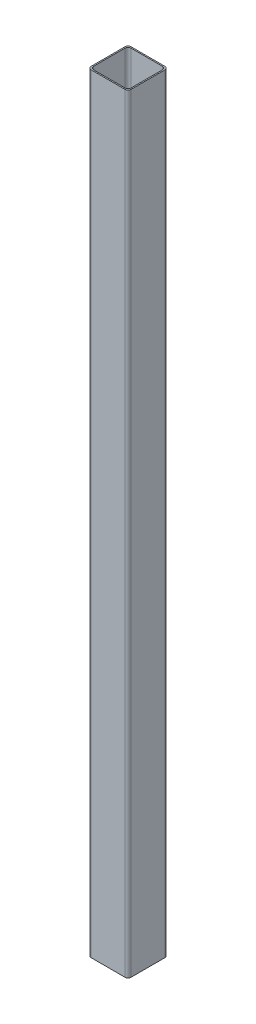
ISO-10303-21;
HEADER;
FILE_DESCRIPTION(('STEP AP214'),'2;1');
FILE_NAME('part.step','',(''),(''),'','','');
FILE_SCHEMA(('AUTOMOTIVE_DESIGN { 1 0 10303 214 1 1 1 1 }'));
ENDSEC;
DATA;
#1=APPLICATION_CONTEXT('core data for automotive mechanical design processes');
#2=APPLICATION_PROTOCOL_DEFINITION('international standard','automotive_design',2000,#1);
#3=PRODUCT_CONTEXT('',#1,'mechanical');
#4=PRODUCT('Part','Part','',(#3));
#5=PRODUCT_RELATED_PRODUCT_CATEGORY('part','',(#4));
#6=PRODUCT_DEFINITION_FORMATION('','',#4);
#7=PRODUCT_DEFINITION_CONTEXT('part definition',#1,'design');
#8=PRODUCT_DEFINITION('design','',#6,#7);
#9=PRODUCT_DEFINITION_SHAPE('','',#8);
#10=(LENGTH_UNIT() NAMED_UNIT(*) SI_UNIT(.MILLI.,.METRE.));
#11=(NAMED_UNIT(*) PLANE_ANGLE_UNIT() SI_UNIT($,.RADIAN.));
#12=(NAMED_UNIT(*) SI_UNIT($,.STERADIAN.) SOLID_ANGLE_UNIT());
#13=UNCERTAINTY_MEASURE_WITH_UNIT(LENGTH_MEASURE(1.E-05),#10,'distance_accuracy_value','');
#14=(GEOMETRIC_REPRESENTATION_CONTEXT(3) GLOBAL_UNCERTAINTY_ASSIGNED_CONTEXT((#13)) GLOBAL_UNIT_ASSIGNED_CONTEXT((#10,
#11,#12)) REPRESENTATION_CONTEXT('',''));
#15=CARTESIAN_POINT('',(0.,0.,0.));
#16=DIRECTION('',(0.,0.,1.));
#17=DIRECTION('',(1.,0.,0.));
#18=AXIS2_PLACEMENT_3D('',#15,#16,#17);
#19=CARTESIAN_POINT('',(0.,385.,0.));
#20=DIRECTION('',(0.,1.,0.));
#21=DIRECTION('',(0.,0.,1.));
#22=AXIS2_PLACEMENT_3D('',#19,#20,#21);
#23=PLANE('',#22);
#24=DIRECTION('',(-1.,0.,0.));
#25=VECTOR('',#24,1.);
#26=CARTESIAN_POINT('',(20.,385.,-20.));
#27=LINE('',#26,#25);
#28=CARTESIAN_POINT('',(17.,385.,-20.));
#29=VERTEX_POINT('',#28);
#30=CARTESIAN_POINT('',(-17.,385.,-20.));
#31=VERTEX_POINT('',#30);
#32=EDGE_CURVE('E183',#29,#31,#27,.T.);
#33=ORIENTED_EDGE('',*,*,#32,.T.);
#34=CARTESIAN_POINT('',(-17.,385.,-17.));
#35=DIRECTION('',(0.,1.,0.));
#36=DIRECTION('',(0.,0.,1.));
#37=AXIS2_PLACEMENT_3D('',#34,#35,#36);
#38=CIRCLE('',#37,3.);
#39=CARTESIAN_POINT('',(-20.,385.,-17.));
#40=VERTEX_POINT('',#39);
#41=EDGE_CURVE('E203',#31,#40,#38,.T.);
#42=ORIENTED_EDGE('',*,*,#41,.T.);
#43=DIRECTION('',(0.,0.,1.));
#44=VECTOR('',#43,1.);
#45=CARTESIAN_POINT('',(-20.,385.,20.));
#46=LINE('',#45,#44);
#47=CARTESIAN_POINT('',(-20.,385.,17.));
#48=VERTEX_POINT('',#47);
#49=EDGE_CURVE('E165',#40,#48,#46,.T.);
#50=ORIENTED_EDGE('',*,*,#49,.T.);
#51=CARTESIAN_POINT('',(-17.,385.,17.));
#52=DIRECTION('',(0.,1.,0.));
#53=DIRECTION('',(0.,0.,1.));
#54=AXIS2_PLACEMENT_3D('',#51,#52,#53);
#55=CIRCLE('',#54,3.);
#56=CARTESIAN_POINT('',(-17.,385.,20.));
#57=VERTEX_POINT('',#56);
#58=EDGE_CURVE('E199',#48,#57,#55,.T.);
#59=ORIENTED_EDGE('',*,*,#58,.T.);
#60=DIRECTION('',(1.,0.,0.));
#61=VECTOR('',#60,1.);
#62=CARTESIAN_POINT('',(20.,385.,20.));
#63=LINE('',#62,#61);
#64=CARTESIAN_POINT('',(17.,385.,20.));
#65=VERTEX_POINT('',#64);
#66=EDGE_CURVE('E275',#57,#65,#63,.T.);
#67=ORIENTED_EDGE('',*,*,#66,.T.);
#68=CARTESIAN_POINT('',(17.,385.,17.));
#69=DIRECTION('',(0.,1.,0.));
#70=DIRECTION('',(0.,0.,1.));
#71=AXIS2_PLACEMENT_3D('',#68,#69,#70);
#72=CIRCLE('',#71,3.);
#73=CARTESIAN_POINT('',(20.,385.,17.));
#74=VERTEX_POINT('',#73);
#75=EDGE_CURVE('E197',#65,#74,#72,.T.);
#76=ORIENTED_EDGE('',*,*,#75,.T.);
#77=DIRECTION('',(0.,0.,-1.));
#78=VECTOR('',#77,1.);
#79=CARTESIAN_POINT('',(20.,385.,20.));
#80=LINE('',#79,#78);
#81=CARTESIAN_POINT('',(20.,385.,-17.));
#82=VERTEX_POINT('',#81);
#83=EDGE_CURVE('E277',#74,#82,#80,.T.);
#84=ORIENTED_EDGE('',*,*,#83,.T.);
#85=CARTESIAN_POINT('',(17.,385.,-17.));
#86=DIRECTION('',(0.,1.,0.));
#87=DIRECTION('',(0.,0.,1.));
#88=AXIS2_PLACEMENT_3D('',#85,#86,#87);
#89=CIRCLE('',#88,3.);
#90=EDGE_CURVE('E201',#82,#29,#89,.T.);
#91=ORIENTED_EDGE('',*,*,#90,.T.);
#92=EDGE_LOOP('',(#33,#42,#50,#59,#67,#76,#84,#91));
#93=FACE_BOUND('',#92,.T.);
#94=DIRECTION('',(0.,0.,-1.));
#95=VECTOR('',#94,1.);
#96=CARTESIAN_POINT('',(18.8,385.,18.8));
#97=LINE('',#96,#95);
#98=CARTESIAN_POINT('',(18.8,385.,15.8));
#99=VERTEX_POINT('',#98);
#100=CARTESIAN_POINT('',(18.8,385.,-15.8));
#101=VERTEX_POINT('',#100);
#102=EDGE_CURVE('E261',#99,#101,#97,.T.);
#103=ORIENTED_EDGE('',*,*,#102,.F.);
#104=CARTESIAN_POINT('',(15.8,385.,15.8));
#105=DIRECTION('',(0.,1.,0.));
#106=DIRECTION('',(0.,0.,1.));
#107=AXIS2_PLACEMENT_3D('',#104,#105,#106);
#108=CIRCLE('',#107,3.);
#109=CARTESIAN_POINT('',(15.8,385.,18.8));
#110=VERTEX_POINT('',#109);
#111=EDGE_CURVE('E240',#99,#110,#108,.F.);
#112=ORIENTED_EDGE('',*,*,#111,.T.);
#113=DIRECTION('',(1.,0.,0.));
#114=VECTOR('',#113,1.);
#115=CARTESIAN_POINT('',(18.8,385.,18.8));
#116=LINE('',#115,#114);
#117=CARTESIAN_POINT('',(-15.8,385.,18.8));
#118=VERTEX_POINT('',#117);
#119=EDGE_CURVE('E256',#118,#110,#116,.T.);
#120=ORIENTED_EDGE('',*,*,#119,.F.);
#121=CARTESIAN_POINT('',(-15.8,385.,15.8));
#122=DIRECTION('',(0.,1.,0.));
#123=DIRECTION('',(0.,0.,1.));
#124=AXIS2_PLACEMENT_3D('',#121,#122,#123);
#125=CIRCLE('',#124,3.);
#126=CARTESIAN_POINT('',(-18.8,385.,15.8));
#127=VERTEX_POINT('',#126);
#128=EDGE_CURVE('E244',#118,#127,#125,.F.);
#129=ORIENTED_EDGE('',*,*,#128,.T.);
#130=DIRECTION('',(0.,0.,1.));
#131=VECTOR('',#130,1.);
#132=CARTESIAN_POINT('',(-18.8,385.,18.8));
#133=LINE('',#132,#131);
#134=CARTESIAN_POINT('',(-18.8,385.,-15.8));
#135=VERTEX_POINT('',#134);
#136=EDGE_CURVE('E174',#135,#127,#133,.T.);
#137=ORIENTED_EDGE('',*,*,#136,.F.);
#138=CARTESIAN_POINT('',(-15.8,385.,-15.8));
#139=DIRECTION('',(0.,1.,0.));
#140=DIRECTION('',(0.,0.,1.));
#141=AXIS2_PLACEMENT_3D('',#138,#139,#140);
#142=CIRCLE('',#141,3.);
#143=CARTESIAN_POINT('',(-15.8,385.,-18.8));
#144=VERTEX_POINT('',#143);
#145=EDGE_CURVE('E11',#135,#144,#142,.F.);
#146=ORIENTED_EDGE('',*,*,#145,.T.);
#147=DIRECTION('',(-1.,0.,0.));
#148=VECTOR('',#147,1.);
#149=CARTESIAN_POINT('',(18.8,385.,-18.8));
#150=LINE('',#149,#148);
#151=CARTESIAN_POINT('',(15.8,385.,-18.8));
#152=VERTEX_POINT('',#151);
#153=EDGE_CURVE('E180',#152,#144,#150,.T.);
#154=ORIENTED_EDGE('',*,*,#153,.F.);
#155=CARTESIAN_POINT('',(15.8,385.,-15.8));
#156=DIRECTION('',(0.,1.,0.));
#157=DIRECTION('',(0.,0.,1.));
#158=AXIS2_PLACEMENT_3D('',#155,#156,#157);
#159=CIRCLE('',#158,3.);
#160=EDGE_CURVE('E236',#152,#101,#159,.F.);
#161=ORIENTED_EDGE('',*,*,#160,.T.);
#162=EDGE_LOOP('',(#103,#112,#120,#129,#137,#146,#154,#161));
#163=FACE_BOUND('',#162,.T.);
#164=ADVANCED_FACE('F32',(#93,#163),#23,.T.);
#165=CARTESIAN_POINT('',(0.,-385.,0.));
#166=DIRECTION('',(0.,1.,0.));
#167=DIRECTION('',(0.,0.,1.));
#168=AXIS2_PLACEMENT_3D('',#165,#166,#167);
#169=PLANE('',#168);
#170=DIRECTION('',(0.,0.,1.));
#171=VECTOR('',#170,1.);
#172=CARTESIAN_POINT('',(-20.,-385.,20.));
#173=LINE('',#172,#171);
#174=CARTESIAN_POINT('',(-20.,-385.,-17.));
#175=VERTEX_POINT('',#174);
#176=CARTESIAN_POINT('',(-20.,-385.,17.));
#177=VERTEX_POINT('',#176);
#178=EDGE_CURVE('E162',#175,#177,#173,.T.);
#179=ORIENTED_EDGE('',*,*,#178,.F.);
#180=CARTESIAN_POINT('',(-17.,-385.,-17.));
#181=DIRECTION('',(0.,1.,0.));
#182=DIRECTION('',(0.,0.,1.));
#183=AXIS2_PLACEMENT_3D('',#180,#181,#182);
#184=CIRCLE('',#183,3.);
#185=CARTESIAN_POINT('',(-17.,-385.,-20.));
#186=VERTEX_POINT('',#185);
#187=EDGE_CURVE('E145',#175,#186,#184,.F.);
#188=ORIENTED_EDGE('',*,*,#187,.T.);
#189=DIRECTION('',(-1.,0.,0.));
#190=VECTOR('',#189,1.);
#191=CARTESIAN_POINT('',(20.,-385.,-20.));
#192=LINE('',#191,#190);
#193=CARTESIAN_POINT('',(17.,-385.,-20.));
#194=VERTEX_POINT('',#193);
#195=EDGE_CURVE('E188',#194,#186,#192,.T.);
#196=ORIENTED_EDGE('',*,*,#195,.F.);
#197=CARTESIAN_POINT('',(17.,-385.,-17.));
#198=DIRECTION('',(0.,1.,0.));
#199=DIRECTION('',(0.,0.,1.));
#200=AXIS2_PLACEMENT_3D('',#197,#198,#199);
#201=CIRCLE('',#200,3.);
#202=CARTESIAN_POINT('',(20.,-385.,-17.));
#203=VERTEX_POINT('',#202);
#204=EDGE_CURVE('E156',#194,#203,#201,.F.);
#205=ORIENTED_EDGE('',*,*,#204,.T.);
#206=DIRECTION('',(0.,0.,-1.));
#207=VECTOR('',#206,1.);
#208=CARTESIAN_POINT('',(20.,-385.,20.));
#209=LINE('',#208,#207);
#210=CARTESIAN_POINT('',(20.,-385.,17.));
#211=VERTEX_POINT('',#210);
#212=EDGE_CURVE('E177',#211,#203,#209,.T.);
#213=ORIENTED_EDGE('',*,*,#212,.F.);
#214=CARTESIAN_POINT('',(17.,-385.,17.));
#215=DIRECTION('',(0.,1.,0.));
#216=DIRECTION('',(0.,0.,1.));
#217=AXIS2_PLACEMENT_3D('',#214,#215,#216);
#218=CIRCLE('',#217,3.);
#219=CARTESIAN_POINT('',(17.,-385.,20.));
#220=VERTEX_POINT('',#219);
#221=EDGE_CURVE('E166',#211,#220,#218,.F.);
#222=ORIENTED_EDGE('',*,*,#221,.T.);
#223=DIRECTION('',(1.,0.,0.));
#224=VECTOR('',#223,1.);
#225=CARTESIAN_POINT('',(20.,-385.,20.));
#226=LINE('',#225,#224);
#227=CARTESIAN_POINT('',(-17.,-385.,20.));
#228=VERTEX_POINT('',#227);
#229=EDGE_CURVE('E173',#228,#220,#226,.T.);
#230=ORIENTED_EDGE('',*,*,#229,.F.);
#231=CARTESIAN_POINT('',(-17.,-385.,17.));
#232=DIRECTION('',(0.,1.,0.));
#233=DIRECTION('',(0.,0.,1.));
#234=AXIS2_PLACEMENT_3D('',#231,#232,#233);
#235=CIRCLE('',#234,3.);
#236=EDGE_CURVE('E172',#228,#177,#235,.F.);
#237=ORIENTED_EDGE('',*,*,#236,.T.);
#238=EDGE_LOOP('',(#179,#188,#196,#205,#213,#222,#230,#237));
#239=FACE_BOUND('',#238,.T.);
#240=DIRECTION('',(0.,0.,1.));
#241=VECTOR('',#240,1.);
#242=CARTESIAN_POINT('',(-18.8,-385.,18.8));
#243=LINE('',#242,#241);
#244=CARTESIAN_POINT('',(-18.8,-385.,-15.8));
#245=VERTEX_POINT('',#244);
#246=CARTESIAN_POINT('',(-18.8,-385.,15.8));
#247=VERTEX_POINT('',#246);
#248=EDGE_CURVE('E248',#245,#247,#243,.T.);
#249=ORIENTED_EDGE('',*,*,#248,.T.);
#250=CARTESIAN_POINT('',(-15.8,-385.,15.8));
#251=DIRECTION('',(0.,1.,0.));
#252=DIRECTION('',(0.,0.,1.));
#253=AXIS2_PLACEMENT_3D('',#250,#251,#252);
#254=CIRCLE('',#253,3.);
#255=CARTESIAN_POINT('',(-15.8,-385.,18.8));
#256=VERTEX_POINT('',#255);
#257=EDGE_CURVE('E242',#247,#256,#254,.T.);
#258=ORIENTED_EDGE('',*,*,#257,.T.);
#259=DIRECTION('',(1.,0.,0.));
#260=VECTOR('',#259,1.);
#261=CARTESIAN_POINT('',(18.8,-385.,18.8));
#262=LINE('',#261,#260);
#263=CARTESIAN_POINT('',(15.8,-385.,18.8));
#264=VERTEX_POINT('',#263);
#265=EDGE_CURVE('E267',#256,#264,#262,.T.);
#266=ORIENTED_EDGE('',*,*,#265,.T.);
#267=CARTESIAN_POINT('',(15.8,-385.,15.8));
#268=DIRECTION('',(0.,1.,0.));
#269=DIRECTION('',(0.,0.,1.));
#270=AXIS2_PLACEMENT_3D('',#267,#268,#269);
#271=CIRCLE('',#270,3.);
#272=CARTESIAN_POINT('',(18.8,-385.,15.8));
#273=VERTEX_POINT('',#272);
#274=EDGE_CURVE('E238',#264,#273,#271,.T.);
#275=ORIENTED_EDGE('',*,*,#274,.T.);
#276=DIRECTION('',(0.,0.,-1.));
#277=VECTOR('',#276,1.);
#278=CARTESIAN_POINT('',(18.8,-385.,18.8));
#279=LINE('',#278,#277);
#280=CARTESIAN_POINT('',(18.8,-385.,-15.8));
#281=VERTEX_POINT('',#280);
#282=EDGE_CURVE('E270',#273,#281,#279,.T.);
#283=ORIENTED_EDGE('',*,*,#282,.T.);
#284=CARTESIAN_POINT('',(15.8,-385.,-15.8));
#285=DIRECTION('',(0.,1.,0.));
#286=DIRECTION('',(0.,0.,1.));
#287=AXIS2_PLACEMENT_3D('',#284,#285,#286);
#288=CIRCLE('',#287,3.);
#289=CARTESIAN_POINT('',(15.8,-385.,-18.8));
#290=VERTEX_POINT('',#289);
#291=EDGE_CURVE('E234',#281,#290,#288,.T.);
#292=ORIENTED_EDGE('',*,*,#291,.T.);
#293=DIRECTION('',(-1.,0.,0.));
#294=VECTOR('',#293,1.);
#295=CARTESIAN_POINT('',(18.8,-385.,-18.8));
#296=LINE('',#295,#294);
#297=CARTESIAN_POINT('',(-15.8,-385.,-18.8));
#298=VERTEX_POINT('',#297);
#299=EDGE_CURVE('E249',#290,#298,#296,.T.);
#300=ORIENTED_EDGE('',*,*,#299,.T.);
#301=CARTESIAN_POINT('',(-15.8,-385.,-15.8));
#302=DIRECTION('',(0.,1.,0.));
#303=DIRECTION('',(0.,0.,1.));
#304=AXIS2_PLACEMENT_3D('',#301,#302,#303);
#305=CIRCLE('',#304,3.);
#306=EDGE_CURVE('E40',#298,#245,#305,.T.);
#307=ORIENTED_EDGE('',*,*,#306,.T.);
#308=EDGE_LOOP('',(#249,#258,#266,#275,#283,#292,#300,#307));
#309=FACE_BOUND('',#308,.T.);
#310=ADVANCED_FACE('F169',(#239,#309),#169,.F.);
#311=CARTESIAN_POINT('',(-20.,385.,20.));
#312=DIRECTION('',(1.,0.,0.));
#313=DIRECTION('',(0.,0.,-1.));
#314=AXIS2_PLACEMENT_3D('',#311,#312,#313);
#315=PLANE('',#314);
#316=ORIENTED_EDGE('',*,*,#49,.F.);
#317=DIRECTION('',(0.,-1.,0.));
#318=VECTOR('',#317,1.);
#319=CARTESIAN_POINT('',(-20.,385.,-17.));
#320=LINE('',#319,#318);
#321=EDGE_CURVE('E149',#40,#175,#320,.T.);
#322=ORIENTED_EDGE('',*,*,#321,.T.);
#323=ORIENTED_EDGE('',*,*,#178,.T.);
#324=DIRECTION('',(0.,-1.,0.));
#325=VECTOR('',#324,1.);
#326=CARTESIAN_POINT('',(-20.,385.,17.));
#327=LINE('',#326,#325);
#328=EDGE_CURVE('E167',#177,#48,#327,.F.);
#329=ORIENTED_EDGE('',*,*,#328,.T.);
#330=EDGE_LOOP('',(#316,#322,#323,#329));
#331=FACE_BOUND('',#330,.T.);
#332=ADVANCED_FACE('F161',(#331),#315,.F.);
#333=CARTESIAN_POINT('',(20.,385.,20.));
#334=DIRECTION('',(0.,0.,-1.));
#335=DIRECTION('',(-1.,0.,0.));
#336=AXIS2_PLACEMENT_3D('',#333,#334,#335);
#337=PLANE('',#336);
#338=ORIENTED_EDGE('',*,*,#66,.F.);
#339=DIRECTION('',(0.,-1.,0.));
#340=VECTOR('',#339,1.);
#341=CARTESIAN_POINT('',(-17.,385.,20.));
#342=LINE('',#341,#340);
#343=EDGE_CURVE('E231',#57,#228,#342,.T.);
#344=ORIENTED_EDGE('',*,*,#343,.T.);
#345=ORIENTED_EDGE('',*,*,#229,.T.);
#346=DIRECTION('',(0.,-1.,0.));
#347=VECTOR('',#346,1.);
#348=CARTESIAN_POINT('',(17.,385.,20.));
#349=LINE('',#348,#347);
#350=EDGE_CURVE('E229',#220,#65,#349,.F.);
#351=ORIENTED_EDGE('',*,*,#350,.T.);
#352=EDGE_LOOP('',(#338,#344,#345,#351));
#353=FACE_BOUND('',#352,.T.);
#354=ADVANCED_FACE('F299',(#353),#337,.F.);
#355=CARTESIAN_POINT('',(20.,385.,20.));
#356=DIRECTION('',(-1.,0.,0.));
#357=DIRECTION('',(0.,0.,1.));
#358=AXIS2_PLACEMENT_3D('',#355,#356,#357);
#359=PLANE('',#358);
#360=ORIENTED_EDGE('',*,*,#212,.T.);
#361=DIRECTION('',(0.,-1.,0.));
#362=VECTOR('',#361,1.);
#363=CARTESIAN_POINT('',(20.,385.,-17.));
#364=LINE('',#363,#362);
#365=EDGE_CURVE('E208',#203,#82,#364,.F.);
#366=ORIENTED_EDGE('',*,*,#365,.T.);
#367=ORIENTED_EDGE('',*,*,#83,.F.);
#368=DIRECTION('',(0.,-1.,0.));
#369=VECTOR('',#368,1.);
#370=CARTESIAN_POINT('',(20.,385.,17.));
#371=LINE('',#370,#369);
#372=EDGE_CURVE('E205',#74,#211,#371,.T.);
#373=ORIENTED_EDGE('',*,*,#372,.T.);
#374=EDGE_LOOP('',(#360,#366,#367,#373));
#375=FACE_BOUND('',#374,.T.);
#376=ADVANCED_FACE('F292',(#375),#359,.F.);
#377=CARTESIAN_POINT('',(20.,385.,-20.));
#378=DIRECTION('',(0.,0.,1.));
#379=DIRECTION('',(1.,0.,0.));
#380=AXIS2_PLACEMENT_3D('',#377,#378,#379);
#381=PLANE('',#380);
#382=ORIENTED_EDGE('',*,*,#195,.T.);
#383=DIRECTION('',(0.,-1.,0.));
#384=VECTOR('',#383,1.);
#385=CARTESIAN_POINT('',(-17.,385.,-20.));
#386=LINE('',#385,#384);
#387=EDGE_CURVE('E150',#186,#31,#386,.F.);
#388=ORIENTED_EDGE('',*,*,#387,.T.);
#389=ORIENTED_EDGE('',*,*,#32,.F.);
#390=DIRECTION('',(0.,-1.,0.));
#391=VECTOR('',#390,1.);
#392=CARTESIAN_POINT('',(17.,385.,-20.));
#393=LINE('',#392,#391);
#394=EDGE_CURVE('E155',#29,#194,#393,.T.);
#395=ORIENTED_EDGE('',*,*,#394,.T.);
#396=EDGE_LOOP('',(#382,#388,#389,#395));
#397=FACE_BOUND('',#396,.T.);
#398=ADVANCED_FACE('F286',(#397),#381,.F.);
#399=CARTESIAN_POINT('',(18.8,385.,18.8));
#400=DIRECTION('',(0.,0.,-1.));
#401=DIRECTION('',(-1.,0.,0.));
#402=AXIS2_PLACEMENT_3D('',#399,#400,#401);
#403=PLANE('',#402);
#404=ORIENTED_EDGE('',*,*,#119,.T.);
#405=DIRECTION('',(0.,-1.,0.));
#406=VECTOR('',#405,1.);
#407=CARTESIAN_POINT('',(15.8,-385.,18.8));
#408=LINE('',#407,#406);
#409=EDGE_CURVE('E221',#110,#264,#408,.T.);
#410=ORIENTED_EDGE('',*,*,#409,.T.);
#411=ORIENTED_EDGE('',*,*,#265,.F.);
#412=DIRECTION('',(0.,-1.,0.));
#413=VECTOR('',#412,1.);
#414=CARTESIAN_POINT('',(-15.8,385.,18.8));
#415=LINE('',#414,#413);
#416=EDGE_CURVE('E219',#256,#118,#415,.F.);
#417=ORIENTED_EDGE('',*,*,#416,.T.);
#418=EDGE_LOOP('',(#404,#410,#411,#417));
#419=FACE_BOUND('',#418,.T.);
#420=ADVANCED_FACE('F318',(#419),#403,.T.);
#421=CARTESIAN_POINT('',(18.8,385.,18.8));
#422=DIRECTION('',(-1.,0.,0.));
#423=DIRECTION('',(0.,0.,1.));
#424=AXIS2_PLACEMENT_3D('',#421,#422,#423);
#425=PLANE('',#424);
#426=ORIENTED_EDGE('',*,*,#102,.T.);
#427=DIRECTION('',(0.,-1.,0.));
#428=VECTOR('',#427,1.);
#429=CARTESIAN_POINT('',(18.8,-385.,-15.8));
#430=LINE('',#429,#428);
#431=EDGE_CURVE('E212',#101,#281,#430,.T.);
#432=ORIENTED_EDGE('',*,*,#431,.T.);
#433=ORIENTED_EDGE('',*,*,#282,.F.);
#434=DIRECTION('',(0.,-1.,0.));
#435=VECTOR('',#434,1.);
#436=CARTESIAN_POINT('',(18.8,385.,15.8));
#437=LINE('',#436,#435);
#438=EDGE_CURVE('E210',#273,#99,#437,.F.);
#439=ORIENTED_EDGE('',*,*,#438,.T.);
#440=EDGE_LOOP('',(#426,#432,#433,#439));
#441=FACE_BOUND('',#440,.T.);
#442=ADVANCED_FACE('F357',(#441),#425,.T.);
#443=CARTESIAN_POINT('',(18.8,385.,-18.8));
#444=DIRECTION('',(0.,0.,1.));
#445=DIRECTION('',(1.,0.,0.));
#446=AXIS2_PLACEMENT_3D('',#443,#444,#445);
#447=PLANE('',#446);
#448=ORIENTED_EDGE('',*,*,#299,.F.);
#449=DIRECTION('',(0.,-1.,0.));
#450=VECTOR('',#449,1.);
#451=CARTESIAN_POINT('',(15.8,385.,-18.8));
#452=LINE('',#451,#450);
#453=EDGE_CURVE('E52',#290,#152,#452,.F.);
#454=ORIENTED_EDGE('',*,*,#453,.T.);
#455=ORIENTED_EDGE('',*,*,#153,.T.);
#456=DIRECTION('',(0.,-1.,0.));
#457=VECTOR('',#456,1.);
#458=CARTESIAN_POINT('',(-15.8,-385.,-18.8));
#459=LINE('',#458,#457);
#460=EDGE_CURVE('E215',#144,#298,#459,.T.);
#461=ORIENTED_EDGE('',*,*,#460,.T.);
#462=EDGE_LOOP('',(#448,#454,#455,#461));
#463=FACE_BOUND('',#462,.T.);
#464=ADVANCED_FACE('F259',(#463),#447,.T.);
#465=CARTESIAN_POINT('',(-18.8,385.,18.8));
#466=DIRECTION('',(1.,0.,0.));
#467=DIRECTION('',(0.,0.,-1.));
#468=AXIS2_PLACEMENT_3D('',#465,#466,#467);
#469=PLANE('',#468);
#470=ORIENTED_EDGE('',*,*,#136,.T.);
#471=DIRECTION('',(0.,-1.,0.));
#472=VECTOR('',#471,1.);
#473=CARTESIAN_POINT('',(-18.8,-385.,15.8));
#474=LINE('',#473,#472);
#475=EDGE_CURVE('E226',#127,#247,#474,.T.);
#476=ORIENTED_EDGE('',*,*,#475,.T.);
#477=ORIENTED_EDGE('',*,*,#248,.F.);
#478=DIRECTION('',(0.,-1.,0.));
#479=VECTOR('',#478,1.);
#480=CARTESIAN_POINT('',(-18.8,385.,-15.8));
#481=LINE('',#480,#479);
#482=EDGE_CURVE('E224',#245,#135,#481,.F.);
#483=ORIENTED_EDGE('',*,*,#482,.T.);
#484=EDGE_LOOP('',(#470,#476,#477,#483));
#485=FACE_BOUND('',#484,.T.);
#486=ADVANCED_FACE('F254',(#485),#469,.T.);
#487=CARTESIAN_POINT('',(-17.,385.,-17.));
#488=DIRECTION('',(0.,-1.,0.));
#489=DIRECTION('',(0.,0.,-1.));
#490=AXIS2_PLACEMENT_3D('',#487,#488,#489);
#491=CYLINDRICAL_SURFACE('',#490,3.);
#492=ORIENTED_EDGE('',*,*,#41,.F.);
#493=ORIENTED_EDGE('',*,*,#387,.F.);
#494=ORIENTED_EDGE('',*,*,#187,.F.);
#495=ORIENTED_EDGE('',*,*,#321,.F.);
#496=EDGE_LOOP('',(#492,#493,#494,#495));
#497=FACE_BOUND('',#496,.T.);
#498=ADVANCED_FACE('F148',(#497),#491,.T.);
#499=CARTESIAN_POINT('',(17.,385.,-17.));
#500=DIRECTION('',(0.,-1.,0.));
#501=DIRECTION('',(0.,0.,-1.));
#502=AXIS2_PLACEMENT_3D('',#499,#500,#501);
#503=CYLINDRICAL_SURFACE('',#502,3.);
#504=ORIENTED_EDGE('',*,*,#90,.F.);
#505=ORIENTED_EDGE('',*,*,#365,.F.);
#506=ORIENTED_EDGE('',*,*,#204,.F.);
#507=ORIENTED_EDGE('',*,*,#394,.F.);
#508=EDGE_LOOP('',(#504,#505,#506,#507));
#509=FACE_BOUND('',#508,.T.);
#510=ADVANCED_FACE('F288',(#509),#503,.T.);
#511=CARTESIAN_POINT('',(15.8,385.,-15.8));
#512=DIRECTION('',(0.,1.,0.));
#513=DIRECTION('',(0.,0.,1.));
#514=AXIS2_PLACEMENT_3D('',#511,#512,#513);
#515=CYLINDRICAL_SURFACE('',#514,3.);
#516=ORIENTED_EDGE('',*,*,#160,.F.);
#517=ORIENTED_EDGE('',*,*,#453,.F.);
#518=ORIENTED_EDGE('',*,*,#291,.F.);
#519=ORIENTED_EDGE('',*,*,#431,.F.);
#520=EDGE_LOOP('',(#516,#517,#518,#519));
#521=FACE_BOUND('',#520,.T.);
#522=ADVANCED_FACE('F333',(#521),#515,.F.);
#523=CARTESIAN_POINT('',(15.8,385.,15.8));
#524=DIRECTION('',(0.,1.,0.));
#525=DIRECTION('',(0.,0.,1.));
#526=AXIS2_PLACEMENT_3D('',#523,#524,#525);
#527=CYLINDRICAL_SURFACE('',#526,3.);
#528=ORIENTED_EDGE('',*,*,#111,.F.);
#529=ORIENTED_EDGE('',*,*,#438,.F.);
#530=ORIENTED_EDGE('',*,*,#274,.F.);
#531=ORIENTED_EDGE('',*,*,#409,.F.);
#532=EDGE_LOOP('',(#528,#529,#530,#531));
#533=FACE_BOUND('',#532,.T.);
#534=ADVANCED_FACE('F336',(#533),#527,.F.);
#535=CARTESIAN_POINT('',(-15.8,385.,15.8));
#536=DIRECTION('',(0.,1.,0.));
#537=DIRECTION('',(0.,0.,1.));
#538=AXIS2_PLACEMENT_3D('',#535,#536,#537);
#539=CYLINDRICAL_SURFACE('',#538,3.);
#540=ORIENTED_EDGE('',*,*,#128,.F.);
#541=ORIENTED_EDGE('',*,*,#416,.F.);
#542=ORIENTED_EDGE('',*,*,#257,.F.);
#543=ORIENTED_EDGE('',*,*,#475,.F.);
#544=EDGE_LOOP('',(#540,#541,#542,#543));
#545=FACE_BOUND('',#544,.T.);
#546=ADVANCED_FACE('F309',(#545),#539,.F.);
#547=CARTESIAN_POINT('',(-15.8,385.,-15.8));
#548=DIRECTION('',(0.,1.,0.));
#549=DIRECTION('',(0.,0.,1.));
#550=AXIS2_PLACEMENT_3D('',#547,#548,#549);
#551=CYLINDRICAL_SURFACE('',#550,3.);
#552=ORIENTED_EDGE('',*,*,#145,.F.);
#553=ORIENTED_EDGE('',*,*,#482,.F.);
#554=ORIENTED_EDGE('',*,*,#306,.F.);
#555=ORIENTED_EDGE('',*,*,#460,.F.);
#556=EDGE_LOOP('',(#552,#553,#554,#555));
#557=FACE_BOUND('',#556,.T.);
#558=ADVANCED_FACE('F258',(#557),#551,.F.);
#559=CARTESIAN_POINT('',(-17.,385.,17.));
#560=DIRECTION('',(0.,-1.,0.));
#561=DIRECTION('',(0.,0.,-1.));
#562=AXIS2_PLACEMENT_3D('',#559,#560,#561);
#563=CYLINDRICAL_SURFACE('',#562,3.);
#564=ORIENTED_EDGE('',*,*,#58,.F.);
#565=ORIENTED_EDGE('',*,*,#328,.F.);
#566=ORIENTED_EDGE('',*,*,#236,.F.);
#567=ORIENTED_EDGE('',*,*,#343,.F.);
#568=EDGE_LOOP('',(#564,#565,#566,#567));
#569=FACE_BOUND('',#568,.T.);
#570=ADVANCED_FACE('F303',(#569),#563,.T.);
#571=CARTESIAN_POINT('',(17.,385.,17.));
#572=DIRECTION('',(0.,-1.,0.));
#573=DIRECTION('',(0.,0.,-1.));
#574=AXIS2_PLACEMENT_3D('',#571,#572,#573);
#575=CYLINDRICAL_SURFACE('',#574,3.);
#576=ORIENTED_EDGE('',*,*,#75,.F.);
#577=ORIENTED_EDGE('',*,*,#350,.F.);
#578=ORIENTED_EDGE('',*,*,#221,.F.);
#579=ORIENTED_EDGE('',*,*,#372,.F.);
#580=EDGE_LOOP('',(#576,#577,#578,#579));
#581=FACE_BOUND('',#580,.T.);
#582=ADVANCED_FACE('F34',(#581),#575,.T.);
#583=CLOSED_SHELL('',(#164,#310,#332,#354,#376,#398,#420,#442,#464,#486,#498,#510,#522,#534,
#546,#558,#570,#582));
#584=MANIFOLD_SOLID_BREP('B2',#583);
#585=ADVANCED_BREP_SHAPE_REPRESENTATION('',(#18,#584),#14);
#586=SHAPE_DEFINITION_REPRESENTATION(#9,#585);
ENDSEC;
END-ISO-10303-21;
